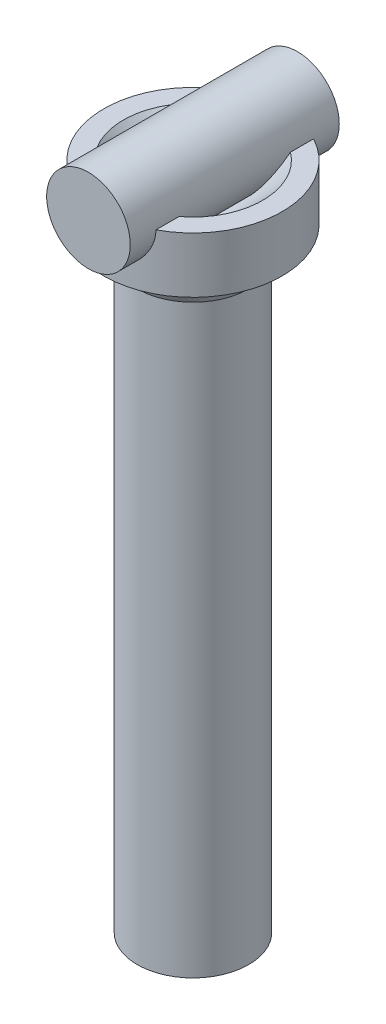
ISO-10303-21;
HEADER;
FILE_DESCRIPTION(('STEP AP214'),'2;1');
FILE_NAME('part.step','',(''),(''),'','','');
FILE_SCHEMA(('AUTOMOTIVE_DESIGN { 1 0 10303 214 1 1 1 1 }'));
ENDSEC;
DATA;
#1=APPLICATION_CONTEXT('core data for automotive mechanical design processes');
#2=APPLICATION_PROTOCOL_DEFINITION('international standard','automotive_design',2000,#1);
#3=PRODUCT_CONTEXT('',#1,'mechanical');
#4=PRODUCT('Part','Part','',(#3));
#5=PRODUCT_RELATED_PRODUCT_CATEGORY('part','',(#4));
#6=PRODUCT_DEFINITION_FORMATION('','',#4);
#7=PRODUCT_DEFINITION_CONTEXT('part definition',#1,'design');
#8=PRODUCT_DEFINITION('design','',#6,#7);
#9=PRODUCT_DEFINITION_SHAPE('','',#8);
#10=(LENGTH_UNIT() NAMED_UNIT(*) SI_UNIT(.MILLI.,.METRE.));
#11=(NAMED_UNIT(*) PLANE_ANGLE_UNIT() SI_UNIT($,.RADIAN.));
#12=(NAMED_UNIT(*) SI_UNIT($,.STERADIAN.) SOLID_ANGLE_UNIT());
#13=UNCERTAINTY_MEASURE_WITH_UNIT(LENGTH_MEASURE(1.E-05),#10,'distance_accuracy_value','');
#14=(GEOMETRIC_REPRESENTATION_CONTEXT(3) GLOBAL_UNCERTAINTY_ASSIGNED_CONTEXT((#13)) GLOBAL_UNIT_ASSIGNED_CONTEXT((#10,
#11,#12)) REPRESENTATION_CONTEXT('',''));
#15=CARTESIAN_POINT('',(0.,0.,0.));
#16=DIRECTION('',(0.,0.,1.));
#17=DIRECTION('',(1.,0.,0.));
#18=AXIS2_PLACEMENT_3D('',#15,#16,#17);
#19=CARTESIAN_POINT('',(0.,24.,0.));
#20=DIRECTION('',(0.,1.,0.));
#21=DIRECTION('',(0.,0.,1.));
#22=AXIS2_PLACEMENT_3D('',#19,#20,#21);
#23=CONICAL_SURFACE('',#22,2.49999999999999,0.785398163397446);
#24=CARTESIAN_POINT('',(0.,22.,0.));
#25=DIRECTION('',(0.,-1.,0.));
#26=DIRECTION('',(0.,0.,-1.));
#27=AXIS2_PLACEMENT_3D('',#24,#25,#26);
#28=CIRCLE('',#27,0.5);
#29=CARTESIAN_POINT('',(0.,22.,-0.5));
#30=VERTEX_POINT('',#29);
#31=EDGE_CURVE('E83',#30,#30,#28,.T.);
#32=ORIENTED_EDGE('',*,*,#31,.T.);
#33=EDGE_LOOP('',(#32));
#34=FACE_BOUND('',#33,.T.);
#35=CARTESIAN_POINT('',(0.,24.,0.));
#36=DIRECTION('',(0.,-1.,0.));
#37=DIRECTION('',(0.,0.,-1.));
#38=AXIS2_PLACEMENT_3D('',#35,#36,#37);
#39=CIRCLE('',#38,2.49999999999999);
#40=CARTESIAN_POINT('',(-1.5,24.,1.99999999999999));
#41=VERTEX_POINT('',#40);
#42=CARTESIAN_POINT('',(-1.5,24.,-1.99999999999999));
#43=VERTEX_POINT('',#42);
#44=EDGE_CURVE('E94',#41,#43,#39,.T.);
#45=ORIENTED_EDGE('',*,*,#44,.F.);
#46=CARTESIAN_POINT('',(-1.49246104136758,24.1502,2.19000458447008));
#47=CARTESIAN_POINT('',(-1.49545373328403,24.1204332284255,2.15194424581476));
#48=CARTESIAN_POINT('',(-1.49756700040411,24.0905299339401,2.11392448433375));
#49=CARTESIAN_POINT('',(-1.49999348097174,24.030429409847,2.03804562222633));
#50=CARTESIAN_POINT('',(-1.50030625716488,24.0002321106229,2.00018656285734));
#51=CARTESIAN_POINT('',(-1.49847011708547,23.9086739873725,1.88635640204489));
#52=CARTESIAN_POINT('',(-1.49349418435268,23.8468523415018,1.81078223914069));
#53=CARTESIAN_POINT('',(-1.4749094087891,23.71887813545,1.65829213932245));
#54=CARTESIAN_POINT('',(-1.46091161586003,23.6526575655866,1.58147602579125));
#55=CARTESIAN_POINT('',(-1.43193911363622,23.5519411644453,1.46981966949783));
#56=CARTESIAN_POINT('',(-1.42097653688784,23.5181940024584,1.43325199984974));
#57=CARTESIAN_POINT('',(-1.39604827781106,23.4501223290974,1.36172665998287));
#58=CARTESIAN_POINT('',(-1.38208450088478,23.4157981967166,1.3267679852641));
#59=CARTESIAN_POINT('',(-1.35671379988755,23.3597842165371,1.27208425136817));
#60=CARTESIAN_POINT('',(-1.34637897901054,23.3382955220747,1.25165709206384));
#61=CARTESIAN_POINT('',(-1.32425868036674,23.2950682808844,1.21188243973796));
#62=CARTESIAN_POINT('',(-1.31247299643341,23.2733296990467,1.19253510072706));
#63=CARTESIAN_POINT('',(-1.27486199850083,23.2080126368588,1.13672986882793));
#64=CARTESIAN_POINT('',(-1.24665384459535,23.164039298895,1.10221549864579));
#65=CARTESIAN_POINT('',(-1.18898169055933,23.0844480574427,1.04728395902017));
#66=CARTESIAN_POINT('',(-1.16084366128249,23.0488790157249,1.02542982177868));
#67=CARTESIAN_POINT('',(-1.09949286441295,22.9785899114538,0.988632459046558));
#68=CARTESIAN_POINT('',(-1.06629014999953,22.9438683217354,0.973675773970397));
#69=CARTESIAN_POINT('',(-0.995311796801577,22.8767286842849,0.951308609800031));
#70=CARTESIAN_POINT('',(-0.9575340140081,22.8443117279519,0.943901684170657));
#71=CARTESIAN_POINT('',(-0.878416605105626,22.7830767578548,0.935581104889029));
#72=CARTESIAN_POINT('',(-0.837066150620353,22.7542703834479,0.934687945918009));
#73=CARTESIAN_POINT('',(-0.728680947529565,22.6865923567045,0.937891950105071));
#74=CARTESIAN_POINT('',(-0.659886964592947,22.6507434865632,0.944960715257169));
#75=CARTESIAN_POINT('',(-0.517814377919438,22.5900864191556,0.961433318398144));
#76=CARTESIAN_POINT('',(-0.444527670679941,22.5652988818479,0.970841475226135));
#77=CARTESIAN_POINT('',(-0.330441882288803,22.5362912717701,0.982944141152358));
#78=CARTESIAN_POINT('',(-0.290792558752224,22.5278980680374,0.986702150792473));
#79=CARTESIAN_POINT('',(-0.210837392361188,22.5143380143809,0.992968429959709));
#80=CARTESIAN_POINT('',(-0.170531534945764,22.5091712361148,0.995476671729714));
#81=CARTESIAN_POINT('',(-0.0896472374492412,22.5021322228247,0.998927653524333));
#82=CARTESIAN_POINT('',(-0.0490695087572387,22.5002533816857,0.999873532429336));
#83=CARTESIAN_POINT('',(0.0321080272166379,22.4997945673366,1.00010249407765));
#84=CARTESIAN_POINT('',(0.072707833096408,22.5012144046421,0.999385672330699));
#85=CARTESIAN_POINT('',(0.151755359037483,22.5071941047252,0.996441053463548));
#86=CARTESIAN_POINT('',(0.19021693166839,22.5116081238985,0.994283505646545));
#87=CARTESIAN_POINT('',(0.266613082470822,22.5233781596632,0.988763521787253));
#88=CARTESIAN_POINT('',(0.304547426989795,22.5307354401478,0.985400568185038));
#89=CARTESIAN_POINT('',(0.379739472723867,22.5483483598889,0.977846968444513));
#90=CARTESIAN_POINT('',(0.416995512690543,22.5586103026348,0.973654528236481));
#91=CARTESIAN_POINT('',(0.490579824669764,22.5819654533556,0.964997471554645));
#92=CARTESIAN_POINT('',(0.52690782956253,22.5950594664542,0.960532777942167));
#93=CARTESIAN_POINT('',(0.622706004793459,22.6338267041692,0.949128484809068));
#94=CARTESIAN_POINT('',(0.681226490131988,22.6620212533671,0.94255511430098));
#95=CARTESIAN_POINT('',(0.794273960047192,22.7259108501976,0.934974670185829));
#96=CARTESIAN_POINT('',(0.848816837910063,22.7615735602941,0.933944093324518));
#97=CARTESIAN_POINT('',(0.939956571088797,22.8299975335892,0.941313798031257));
#98=CARTESIAN_POINT('',(0.977720772666259,22.8614043774955,0.947512176784059));
#99=CARTESIAN_POINT('',(1.04897037493311,22.9266907882809,0.967167336487991));
#100=CARTESIAN_POINT('',(1.08245887689232,22.9605685346058,0.980618819167859));
#101=CARTESIAN_POINT('',(1.14440220316641,23.0291852898999,1.01430416015395));
#102=CARTESIAN_POINT('',(1.17287644305598,23.0639203552671,1.03451093867237));
#103=CARTESIAN_POINT('',(1.22510836085955,23.133395842664,1.08031759598592));
#104=CARTESIAN_POINT('',(1.24885754782806,23.1681361640452,1.1059270162718));
#105=CARTESIAN_POINT('',(1.31004286117673,23.2655989414959,1.18374208422258));
#106=CARTESIAN_POINT('',(1.34258970129083,23.3277422851952,1.24044893459234));
#107=CARTESIAN_POINT('',(1.39726253847492,23.4502880679421,1.36084362672535));
#108=CARTESIAN_POINT('',(1.41931116369436,23.5106745923373,1.42457916220568));
#109=CARTESIAN_POINT('',(1.45231486904234,23.6210787296744,1.54613938689888));
#110=CARTESIAN_POINT('',(1.46442244246609,23.6713185627049,1.60346072260979));
#111=CARTESIAN_POINT('',(1.48326431981676,23.7708797220947,1.7198310722983));
#112=CARTESIAN_POINT('',(1.48999344315336,23.8202001182999,1.77888169534467));
#113=CARTESIAN_POINT('',(1.49845113117792,23.9167398743214,1.89641425578346));
#114=CARTESIAN_POINT('',(1.50030683599659,23.9639803470776,1.95487015180718));
#115=CARTESIAN_POINT('',(1.49961517730403,24.0576531588243,2.07219713550475));
#116=CARTESIAN_POINT('',(1.49707731055579,24.104087022263,2.13106705442375));
#117=CARTESIAN_POINT('',(1.49246104136759,24.1501999999999,2.19000458447017));
#118=B_SPLINE_CURVE_WITH_KNOTS('',3,(#46,#47,#48,#49,#50,#51,#52,#53,#54,#55,#56,#57,#58,#59,
#60,#61,#62,#63,#64,#65,#66,#67,#68,#69,#70,#71,#72,#73,#74,#75,#76,#77,#78,#79,#80,#81,#82,#83,
#84,#85,#86,#87,#88,#89,#90,#91,#92,#93,#94,#95,#96,#97,#98,#99,#100,#101,#102,#103,#104,#105,
#106,#107,#108,#109,#110,#111,#112,#113,#114,#115,#116,#117),.UNSPECIFIED.,.F.,.F.,(4,2,2,2,2,2,
2,2,2,2,2,2,2,2,2,2,2,2,2,2,2,2,2,2,2,2,2,2,2,2,2,2,2,2,2,4),(0.,0.145218511898956,
0.290472289044873,0.583447950018386,0.889985272931979,1.0427587650513,1.19543554933813,
1.28958003770597,1.38373791940917,1.57075839213748,1.72118090446192,1.87130862936062,
2.02150698268081,2.17217771163149,2.40462498038458,2.6375046069712,2.75947822110414,
2.88145454412809,3.00318551002909,3.12490948356831,3.24109378661079,3.35732803508536,
3.47381648658153,3.59033809798078,3.78559583698783,3.98002496285916,4.12783770141319,
4.27554261121989,4.42266238146214,4.57004418512804,4.83911256225435,5.11013440208466,
5.34142216035682,5.57293243031811,5.79834003308423,6.02326102245815),.UNSPECIFIED.);
#119=CARTESIAN_POINT('',(1.5,24.,1.99999999999999));
#120=VERTEX_POINT('',#119);
#121=EDGE_CURVE('E91',#41,#120,#118,.T.);
#122=ORIENTED_EDGE('',*,*,#121,.T.);
#123=CARTESIAN_POINT('',(1.5,24.,-1.99999999999999));
#124=VERTEX_POINT('',#123);
#125=EDGE_CURVE('E90',#124,#120,#39,.T.);
#126=ORIENTED_EDGE('',*,*,#125,.F.);
#127=CARTESIAN_POINT('',(1.49246104136758,24.1502,-2.19000458447008));
#128=CARTESIAN_POINT('',(1.49545373328403,24.1204332284255,-2.15194424581476));
#129=CARTESIAN_POINT('',(1.49756700040411,24.0905299339401,-2.11392448433375));
#130=CARTESIAN_POINT('',(1.49999348097174,24.030429409847,-2.03804562222633));
#131=CARTESIAN_POINT('',(1.50030625716488,24.0002321106229,-2.00018656285734));
#132=CARTESIAN_POINT('',(1.49847011708547,23.9086739873725,-1.88635640204489));
#133=CARTESIAN_POINT('',(1.49349418435268,23.8468523415018,-1.81078223914069));
#134=CARTESIAN_POINT('',(1.4749094087891,23.71887813545,-1.65829213932245));
#135=CARTESIAN_POINT('',(1.46091161586003,23.6526575655866,-1.58147602579125));
#136=CARTESIAN_POINT('',(1.43193911363622,23.5519411644453,-1.46981966949783));
#137=CARTESIAN_POINT('',(1.42097653688784,23.5181940024584,-1.43325199984974));
#138=CARTESIAN_POINT('',(1.39604827781106,23.4501223290974,-1.36172665998287));
#139=CARTESIAN_POINT('',(1.38208450088478,23.4157981967166,-1.3267679852641));
#140=CARTESIAN_POINT('',(1.35671379988755,23.3597842165371,-1.27208425136817));
#141=CARTESIAN_POINT('',(1.34637897901054,23.3382955220747,-1.25165709206384));
#142=CARTESIAN_POINT('',(1.32425868036674,23.2950682808844,-1.21188243973796));
#143=CARTESIAN_POINT('',(1.31247299643341,23.2733296990467,-1.19253510072706));
#144=CARTESIAN_POINT('',(1.27486199850083,23.2080126368588,-1.13672986882793));
#145=CARTESIAN_POINT('',(1.24665384459535,23.164039298895,-1.10221549864579));
#146=CARTESIAN_POINT('',(1.18898169055933,23.0844480574427,-1.04728395902017));
#147=CARTESIAN_POINT('',(1.16084366128249,23.0488790157249,-1.02542982177868));
#148=CARTESIAN_POINT('',(1.09949286441295,22.9785899114538,-0.988632459046558));
#149=CARTESIAN_POINT('',(1.06629014999953,22.9438683217354,-0.973675773970397));
#150=CARTESIAN_POINT('',(0.995311796801577,22.8767286842849,-0.951308609800031));
#151=CARTESIAN_POINT('',(0.9575340140081,22.8443117279519,-0.943901684170657));
#152=CARTESIAN_POINT('',(0.878416605105626,22.7830767578548,-0.935581104889029));
#153=CARTESIAN_POINT('',(0.837066150620353,22.7542703834479,-0.934687945918009));
#154=CARTESIAN_POINT('',(0.728680947529565,22.6865923567045,-0.937891950105071));
#155=CARTESIAN_POINT('',(0.659886964592947,22.6507434865632,-0.944960715257169));
#156=CARTESIAN_POINT('',(0.517814377919438,22.5900864191556,-0.961433318398144));
#157=CARTESIAN_POINT('',(0.444527670679941,22.5652988818479,-0.970841475226135));
#158=CARTESIAN_POINT('',(0.330441882288803,22.5362912717701,-0.982944141152358));
#159=CARTESIAN_POINT('',(0.290792558752224,22.5278980680374,-0.986702150792473));
#160=CARTESIAN_POINT('',(0.210837392361188,22.5143380143809,-0.992968429959709));
#161=CARTESIAN_POINT('',(0.170531534945764,22.5091712361148,-0.995476671729714));
#162=CARTESIAN_POINT('',(0.0896472374492412,22.5021322228247,-0.998927653524333));
#163=CARTESIAN_POINT('',(0.0490695087572387,22.5002533816857,-0.999873532429336));
#164=CARTESIAN_POINT('',(-0.0321080272166379,22.4997945673366,-1.00010249407765));
#165=CARTESIAN_POINT('',(-0.072707833096408,22.5012144046421,-0.999385672330699));
#166=CARTESIAN_POINT('',(-0.151755359037483,22.5071941047252,-0.996441053463548));
#167=CARTESIAN_POINT('',(-0.19021693166839,22.5116081238985,-0.994283505646545));
#168=CARTESIAN_POINT('',(-0.266613082470822,22.5233781596632,-0.988763521787253));
#169=CARTESIAN_POINT('',(-0.304547426989795,22.5307354401478,-0.985400568185038));
#170=CARTESIAN_POINT('',(-0.379739472723867,22.5483483598889,-0.977846968444513));
#171=CARTESIAN_POINT('',(-0.416995512690543,22.5586103026348,-0.973654528236481));
#172=CARTESIAN_POINT('',(-0.490579824669764,22.5819654533556,-0.964997471554645));
#173=CARTESIAN_POINT('',(-0.52690782956253,22.5950594664542,-0.960532777942167));
#174=CARTESIAN_POINT('',(-0.622706004793459,22.6338267041692,-0.949128484809068));
#175=CARTESIAN_POINT('',(-0.681226490131988,22.6620212533671,-0.94255511430098));
#176=CARTESIAN_POINT('',(-0.794273960047192,22.7259108501976,-0.934974670185829));
#177=CARTESIAN_POINT('',(-0.848816837910063,22.7615735602941,-0.933944093324518));
#178=CARTESIAN_POINT('',(-0.939956571088797,22.8299975335892,-0.941313798031257));
#179=CARTESIAN_POINT('',(-0.977720772666259,22.8614043774955,-0.947512176784059));
#180=CARTESIAN_POINT('',(-1.04897037493311,22.9266907882809,-0.967167336487991));
#181=CARTESIAN_POINT('',(-1.08245887689232,22.9605685346058,-0.980618819167859));
#182=CARTESIAN_POINT('',(-1.14440220316641,23.0291852898999,-1.01430416015395));
#183=CARTESIAN_POINT('',(-1.17287644305598,23.0639203552671,-1.03451093867237));
#184=CARTESIAN_POINT('',(-1.22510836085955,23.133395842664,-1.08031759598592));
#185=CARTESIAN_POINT('',(-1.24885754782806,23.1681361640452,-1.1059270162718));
#186=CARTESIAN_POINT('',(-1.31004286117673,23.2655989414959,-1.18374208422258));
#187=CARTESIAN_POINT('',(-1.34258970129083,23.3277422851952,-1.24044893459234));
#188=CARTESIAN_POINT('',(-1.39726253847492,23.4502880679421,-1.36084362672535));
#189=CARTESIAN_POINT('',(-1.41931116369436,23.5106745923373,-1.42457916220568));
#190=CARTESIAN_POINT('',(-1.45231486904234,23.6210787296744,-1.54613938689888));
#191=CARTESIAN_POINT('',(-1.46442244246609,23.6713185627049,-1.60346072260979));
#192=CARTESIAN_POINT('',(-1.48326431981676,23.7708797220947,-1.7198310722983));
#193=CARTESIAN_POINT('',(-1.48999344315336,23.8202001182999,-1.77888169534467));
#194=CARTESIAN_POINT('',(-1.49845113117792,23.9167398743214,-1.89641425578346));
#195=CARTESIAN_POINT('',(-1.50030683599659,23.9639803470776,-1.95487015180718));
#196=CARTESIAN_POINT('',(-1.49961517730403,24.0576531588243,-2.07219713550475));
#197=CARTESIAN_POINT('',(-1.49707731055579,24.104087022263,-2.13106705442375));
#198=CARTESIAN_POINT('',(-1.49246104136759,24.1501999999999,-2.19000458447017));
#199=B_SPLINE_CURVE_WITH_KNOTS('',3,(#127,#128,#129,#130,#131,#132,#133,#134,#135,#136,#137,
#138,#139,#140,#141,#142,#143,#144,#145,#146,#147,#148,#149,#150,#151,#152,#153,#154,#155,#156,
#157,#158,#159,#160,#161,#162,#163,#164,#165,#166,#167,#168,#169,#170,#171,#172,#173,#174,#175,
#176,#177,#178,#179,#180,#181,#182,#183,#184,#185,#186,#187,#188,#189,#190,#191,#192,#193,#194,
#195,#196,#197,#198),.UNSPECIFIED.,.F.,.F.,(4,2,2,2,2,2,2,2,2,2,2,2,2,2,2,2,2,2,2,2,2,2,2,2,2,2,
2,2,2,2,2,2,2,2,2,4),(0.,0.145218511898956,0.290472289044873,0.583447950018386,
0.889985272931979,1.0427587650513,1.19543554933813,1.28958003770597,1.38373791940917,
1.57075839213748,1.72118090446192,1.87130862936062,2.02150698268081,2.17217771163149,
2.40462498038458,2.6375046069712,2.75947822110414,2.88145454412809,3.00318551002909,
3.12490948356831,3.24109378661079,3.35732803508536,3.47381648658153,3.59033809798078,
3.78559583698783,3.98002496285916,4.12783770141319,4.27554261121989,4.42266238146214,
4.57004418512804,4.83911256225435,5.11013440208466,5.34142216035682,5.57293243031811,
5.79834003308423,6.02326102245815),.UNSPECIFIED.);
#200=EDGE_CURVE('E131',#124,#43,#199,.T.);
#201=ORIENTED_EDGE('',*,*,#200,.T.);
#202=EDGE_LOOP('',(#45,#122,#126,#201));
#203=FACE_BOUND('',#202,.T.);
#204=ADVANCED_FACE('F32',(#34,#203),#23,.F.);
#205=CARTESIAN_POINT('',(2.49999999999999,24.,0.));
#206=DIRECTION('',(0.,1.,0.));
#207=DIRECTION('',(0.,0.,1.));
#208=AXIS2_PLACEMENT_3D('',#205,#206,#207);
#209=PLANE('',#208);
#210=CARTESIAN_POINT('',(0.,24.,0.));
#211=DIRECTION('',(0.,-1.,0.));
#212=DIRECTION('',(0.,0.,-1.));
#213=AXIS2_PLACEMENT_3D('',#210,#211,#212);
#214=CIRCLE('',#213,3.2);
#215=CARTESIAN_POINT('',(1.5,24.,-2.82665880502051));
#216=VERTEX_POINT('',#215);
#217=CARTESIAN_POINT('',(1.5,24.,2.82665880502051));
#218=VERTEX_POINT('',#217);
#219=EDGE_CURVE('E88',#216,#218,#214,.T.);
#220=ORIENTED_EDGE('',*,*,#219,.F.);
#221=DIRECTION('',(0.,0.,-1.));
#222=VECTOR('',#221,1.);
#223=CARTESIAN_POINT('',(1.5,24.,3.75));
#224=LINE('',#223,#222);
#225=EDGE_CURVE('E60',#216,#124,#224,.F.);
#226=ORIENTED_EDGE('',*,*,#225,.T.);
#227=ORIENTED_EDGE('',*,*,#125,.T.);
#228=EDGE_CURVE('E77',#120,#218,#224,.F.);
#229=ORIENTED_EDGE('',*,*,#228,.T.);
#230=EDGE_LOOP('',(#220,#226,#227,#229));
#231=FACE_BOUND('',#230,.T.);
#232=ADVANCED_FACE('F87',(#231),#209,.T.);
#233=CARTESIAN_POINT('',(-1.5,24.,2.82665880502051));
#234=VERTEX_POINT('',#233);
#235=CARTESIAN_POINT('',(-1.50000000000053,24.0000000000016,-2.82665880502057));
#236=VERTEX_POINT('',#235);
#237=EDGE_CURVE('E95',#234,#236,#214,.T.);
#238=ORIENTED_EDGE('',*,*,#237,.F.);
#239=DIRECTION('',(0.,0.,-1.));
#240=VECTOR('',#239,1.);
#241=CARTESIAN_POINT('',(-1.5,24.,3.75));
#242=LINE('',#241,#240);
#243=EDGE_CURVE('E52',#234,#41,#242,.T.);
#244=ORIENTED_EDGE('',*,*,#243,.T.);
#245=ORIENTED_EDGE('',*,*,#44,.T.);
#246=EDGE_CURVE('E129',#43,#236,#242,.T.);
#247=ORIENTED_EDGE('',*,*,#246,.T.);
#248=EDGE_LOOP('',(#238,#244,#245,#247));
#249=FACE_BOUND('',#248,.T.);
#250=ADVANCED_FACE('F158',(#249),#209,.T.);
#251=CARTESIAN_POINT('',(0.,0.,0.));
#252=DIRECTION('',(0.,-1.,0.));
#253=DIRECTION('',(0.,0.,-1.));
#254=AXIS2_PLACEMENT_3D('',#251,#252,#253);
#255=CYLINDRICAL_SURFACE('',#254,3.2);
#256=CARTESIAN_POINT('',(0.,22.,0.));
#257=DIRECTION('',(0.,-1.,0.));
#258=DIRECTION('',(0.,0.,-1.));
#259=AXIS2_PLACEMENT_3D('',#256,#257,#258);
#260=CIRCLE('',#259,3.2);
#261=CARTESIAN_POINT('',(0.,22.,-3.2));
#262=VERTEX_POINT('',#261);
#263=EDGE_CURVE('E99',#262,#262,#260,.T.);
#264=ORIENTED_EDGE('',*,*,#263,.F.);
#265=EDGE_LOOP('',(#264));
#266=FACE_BOUND('',#265,.T.);
#267=ORIENTED_EDGE('',*,*,#237,.T.);
#268=CARTESIAN_POINT('',(0.,25.5,-3.2));
#269=CARTESIAN_POINT('',(-0.0794366297653684,25.4999956105829,-3.19999630571425));
#270=CARTESIAN_POINT('',(-0.158985054285573,25.4936526432925,-3.19700957899868));
#271=CARTESIAN_POINT('',(-0.315767144342182,25.4685442516593,-3.18535757334793));
#272=CARTESIAN_POINT('',(-0.392995334806227,25.449751539829,-3.17667982118131));
#273=CARTESIAN_POINT('',(-0.542623613933926,25.4006198880662,-3.15456154654934));
#274=CARTESIAN_POINT('',(-0.615040476822123,25.3703238372491,-3.14113872828529));
#275=CARTESIAN_POINT('',(-0.753673316550172,25.2992496399022,-3.11079077785621));
#276=CARTESIAN_POINT('',(-0.8198902957291,25.2584731917509,-3.09386621324576));
#277=CARTESIAN_POINT('',(-0.948350357177739,25.1650249277608,-3.0570148530726));
#278=CARTESIAN_POINT('',(-1.01017369872327,25.1118216432957,-3.03697404361316));
#279=CARTESIAN_POINT('',(-1.12439785354931,24.9961641953044,-2.99656590387073));
#280=CARTESIAN_POINT('',(-1.17679240559473,24.933703934463,-2.97619836632648));
#281=CARTESIAN_POINT('',(-1.27411857201608,24.7963434071221,-2.93591183357015));
#282=CARTESIAN_POINT('',(-1.31833010930722,24.7208943837464,-2.91611100881908));
#283=CARTESIAN_POINT('',(-1.39325151163875,24.562587259413,-2.8810715047924));
#284=CARTESIAN_POINT('',(-1.4239700636606,24.47973396691,-2.86582989225174));
#285=CARTESIAN_POINT('',(-1.46919263785962,24.3137612794281,-2.84290120635756));
#286=CARTESIAN_POINT('',(-1.48450988794257,24.2309177721529,-2.83483816808474));
#287=CARTESIAN_POINT('',(-1.50101060360856,24.0634755266261,-2.82613943112327));
#288=CARTESIAN_POINT('',(-1.50220525058387,23.9788782300868,-2.82549785659326));
#289=CARTESIAN_POINT('',(-1.49102860152934,23.8195723747177,-2.83140540410836));
#290=CARTESIAN_POINT('',(-1.48002746065053,23.7447346838905,-2.83722835518323));
#291=CARTESIAN_POINT('',(-1.44711565103969,23.5981251446924,-2.85415400915747));
#292=CARTESIAN_POINT('',(-1.42520214213451,23.5263540997636,-2.86525808654715));
#293=CARTESIAN_POINT('',(-1.37065958454469,23.3859141522109,-2.89175132581127));
#294=CARTESIAN_POINT('',(-1.33779469146436,23.3173552125722,-2.90723355127044));
#295=CARTESIAN_POINT('',(-1.26245573982023,23.186416964084,-2.94073170962084));
#296=CARTESIAN_POINT('',(-1.21997747050553,23.124040380433,-2.95874875147367));
#297=CARTESIAN_POINT('',(-1.12117144504836,23.0000360348979,-2.99768064068318));
#298=CARTESIAN_POINT('',(-1.06383576537821,22.9392404977255,-3.01869659998739));
#299=CARTESIAN_POINT('',(-0.939641687550934,22.8278067269063,-3.05963196112561));
#300=CARTESIAN_POINT('',(-0.872779758723928,22.7771722760493,-3.07955095258331));
#301=CARTESIAN_POINT('',(-0.728323977918188,22.6858067067883,-3.11693783151282));
#302=CARTESIAN_POINT('',(-0.650429064841608,22.6455008665032,-3.13429076469825));
#303=CARTESIAN_POINT('',(-0.487942227794179,22.5788711291003,-3.16365420400246));
#304=CARTESIAN_POINT('',(-0.403355047372972,22.5525374286218,-3.1756684549702));
#305=CARTESIAN_POINT('',(-0.236758036703878,22.5165412333474,-3.19224313378799));
#306=CARTESIAN_POINT('',(-0.155037856315182,22.5057675969872,-3.19729898462949));
#307=CARTESIAN_POINT('',(0.00919528809397387,22.4977795082271,-3.20103907716323));
#308=CARTESIAN_POINT('',(0.0917079278381507,22.5005597272975,-3.199725822791));
#309=CARTESIAN_POINT('',(0.249398024817891,22.5188907886389,-3.19117976213987));
#310=CARTESIAN_POINT('',(0.324699508933728,22.5335841944089,-3.18434450990737));
#311=CARTESIAN_POINT('',(0.471643871417134,22.5740401001974,-3.16591825802244));
#312=CARTESIAN_POINT('',(0.543286322002912,22.5998038911679,-3.15432670372993));
#313=CARTESIAN_POINT('',(0.683383574707804,22.6624440265986,-3.12701756569302));
#314=CARTESIAN_POINT('',(0.751674047016102,22.6996359188851,-3.11118471264979));
#315=CARTESIAN_POINT('',(0.88128616247221,22.783731219636,-3.07698472270415));
#316=CARTESIAN_POINT('',(0.942604726049461,22.8306388940561,-3.05861647375887));
#317=CARTESIAN_POINT('',(1.06226746295268,22.9376501866046,-3.01925452981606));
#318=CARTESIAN_POINT('',(1.11986840035393,22.9985541611109,-2.99817233580377));
#319=CARTESIAN_POINT('',(1.22431969123982,23.1293394865031,-2.95705916335382));
#320=CARTESIAN_POINT('',(1.27116477824616,23.1992252091888,-2.93702870357223));
#321=CARTESIAN_POINT('',(1.35418065576862,23.3490279572482,-2.89971388021076));
#322=CARTESIAN_POINT('',(1.38994353105744,23.4292017300856,-2.88254332558056));
#323=CARTESIAN_POINT('',(1.4470971383464,23.5955032981221,-2.85428508393637));
#324=CARTESIAN_POINT('',(1.46850394342155,23.6816243151755,-2.84319059671076));
#325=CARTESIAN_POINT('',(1.49455896187423,23.8489905954208,-2.82957416856734));
#326=CARTESIAN_POINT('',(1.50054972888926,23.929970739588,-2.82636665307332));
#327=CARTESIAN_POINT('',(1.49937130319664,24.0917963082829,-2.82699286139304));
#328=CARTESIAN_POINT('',(1.49220590575928,24.1726417649312,-2.83082455454675));
#329=CARTESIAN_POINT('',(1.46613131656595,24.3256303053175,-2.84440619852351));
#330=CARTESIAN_POINT('',(1.44813274734755,24.3979740549795,-2.85369602866639));
#331=CARTESIAN_POINT('',(1.40193210541393,24.538578312548,-2.87667309849877));
#332=CARTESIAN_POINT('',(1.37372698279688,24.6068375928292,-2.89036165246904));
#333=CARTESIAN_POINT('',(1.30578840174151,24.7423181678849,-2.92171219398703));
#334=CARTESIAN_POINT('',(1.26541393094301,24.8091697357933,-2.93957763369423));
#335=CARTESIAN_POINT('',(1.17505974072646,24.9355618374978,-2.97684766005847));
#336=CARTESIAN_POINT('',(1.12507549698615,24.99509890587,-2.99625296915541));
#337=CARTESIAN_POINT('',(1.01093776241371,25.1114406539838,-3.03677948258486));
#338=CARTESIAN_POINT('',(0.945860595498029,25.167352978272,-3.05787468390215));
#339=CARTESIAN_POINT('',(0.806562992145148,25.2676031950751,-3.09753038570267));
#340=CARTESIAN_POINT('',(0.732338206421694,25.3119355503386,-3.11608967155914));
#341=CARTESIAN_POINT('',(0.576903485633842,25.3873025546057,-3.14856405697806));
#342=CARTESIAN_POINT('',(0.49572795580457,25.4183986152204,-3.16250053665866));
#343=CARTESIAN_POINT('',(0.328585281775291,25.466130445569,-3.18419214255065));
#344=CARTESIAN_POINT('',(0.242633177608916,25.4828091394575,-3.19196561184219));
#345=CARTESIAN_POINT('',(0.129990114749172,25.4945850673244,-3.19746509257475));
#346=CARTESIAN_POINT('',(0.104046547063509,25.4966134225616,-3.19841374704826));
#347=CARTESIAN_POINT('',(0.0520726592552672,25.4993216223633,-3.19968181283614));
#348=CARTESIAN_POINT('',(0.0260423373483138,25.5000014390173,-3.20000121112686));
#349=CARTESIAN_POINT('',(0.,25.5,-3.2));
#350=B_SPLINE_CURVE_WITH_KNOTS('',3,(#268,#269,#270,#271,#272,#273,#274,#275,#276,#277,#278,
#279,#280,#281,#282,#283,#284,#285,#286,#287,#288,#289,#290,#291,#292,#293,#294,#295,#296,#297,
#298,#299,#300,#301,#302,#303,#304,#305,#306,#307,#308,#309,#310,#311,#312,#313,#314,#315,#316,
#317,#318,#319,#320,#321,#322,#323,#324,#325,#326,#327,#328,#329,#330,#331,#332,#333,#334,#335,
#336,#337,#338,#339,#340,#341,#342,#343,#344,#345,#346,#347,#348,#349),.UNSPECIFIED.,.T.,.F.,(4,
2,2,2,2,2,2,2,2,2,2,2,2,2,2,2,2,2,2,2,2,2,2,2,2,2,2,2,2,2,2,2,2,2,2,2,2,2,2,2,4),(0.,
0.238203501088987,0.476930834285989,0.714776698722004,0.952584043830981,1.20348916300414,
1.45456028706045,1.72218974999843,1.98964665571215,2.24209356207649,2.49434058339923,
2.72088002998001,2.94747846905439,3.17931153510989,3.41124634347932,3.66861529673091,
3.92607988679166,4.19287274050011,4.45947815428198,4.70590077523508,4.95222652601424,
5.18224856612757,5.41229743710969,5.64937682702354,5.88656053405106,6.14473054024122,
6.40302668810359,6.66993374182533,6.93654146493569,7.1789957704764,7.42138014415691,
7.64578370611675,7.87025437934698,8.10962662086821,8.34911183707249,8.61293149323581,
8.87687707137174,9.13958432454605,9.40150671085487,9.4795972286001,9.55768936255935),.UNSPECIFIED.);
#351=EDGE_CURVE('E11',#236,#216,#350,.T.);
#352=ORIENTED_EDGE('',*,*,#351,.T.);
#353=ORIENTED_EDGE('',*,*,#219,.T.);
#354=CARTESIAN_POINT('',(-1.5,24.,2.82665880502051));
#355=CARTESIAN_POINT('',(-1.49999534442179,24.0788945253923,2.8266642148502));
#356=CARTESIAN_POINT('',(-1.49373514764765,24.1579051491551,2.83001078526979));
#357=CARTESIAN_POINT('',(-1.46898675331296,24.3135596443632,2.84293191540868));
#358=CARTESIAN_POINT('',(-1.45046975054932,24.3901974942605,2.85252114537087));
#359=CARTESIAN_POINT('',(-1.40214204913472,24.5385683858882,2.87658052999138));
#360=CARTESIAN_POINT('',(-1.37238575402327,24.6103231203088,2.89102713620963));
#361=CARTESIAN_POINT('',(-1.30258883001776,24.7478046256391,2.92313754926766));
#362=CARTESIAN_POINT('',(-1.262548773274,24.8135317316278,2.94080117710839));
#363=CARTESIAN_POINT('',(-1.16993217317623,24.9423346348126,2.97891569935292));
#364=CARTESIAN_POINT('',(-1.11666038099966,25.0048784693518,2.99947571550853));
#365=CARTESIAN_POINT('',(-1.00054397871763,25.1205498879335,3.04018037561008));
#366=CARTESIAN_POINT('',(-0.937695082888671,25.1736732331932,3.06032482898787));
#367=CARTESIAN_POINT('',(-0.799783962976717,25.2719735796933,3.09931652970437));
#368=CARTESIAN_POINT('',(-0.72422728837474,25.3165180882463,3.11802260082004));
#369=CARTESIAN_POINT('',(-0.565653325821284,25.3920254344051,3.15064615897713));
#370=CARTESIAN_POINT('',(-0.48264022040496,25.4229958295168,3.16456630968837));
#371=CARTESIAN_POINT('',(-0.317126806316638,25.4684406191745,3.18526856053539));
#372=CARTESIAN_POINT('',(-0.234931908001022,25.4838416777607,3.19244952784134));
#373=CARTESIAN_POINT('',(-0.0688336019528179,25.5007397877499,3.20033754266356));
#374=CARTESIAN_POINT('',(0.0150688889533723,25.5022441128753,3.2010479769342));
#375=CARTESIAN_POINT('',(0.175325908645041,25.4917147298427,3.19612237590297));
#376=CARTESIAN_POINT('',(0.25176600077225,25.4807099792309,3.19096867300393));
#377=CARTESIAN_POINT('',(0.401566261489637,25.4472854024862,3.17559688118972));
#378=CARTESIAN_POINT('',(0.474926200839514,25.4248647283478,3.16537841605189));
#379=CARTESIAN_POINT('',(0.617827561974966,25.3690376676135,3.14064176478271));
#380=CARTESIAN_POINT('',(0.687295991318203,25.3354728983236,3.12606190795924));
#381=CARTESIAN_POINT('',(0.819793243763455,25.2584974256371,3.09396076425213));
#382=CARTESIAN_POINT('',(0.882819694051571,25.2150831131193,3.07643839977242));
#383=CARTESIAN_POINT('',(1.00639503519307,25.1153482177645,3.03837115452596));
#384=CARTESIAN_POINT('',(1.06626938105455,25.0582407031403,3.01769593797095));
#385=CARTESIAN_POINT('',(1.17592899904208,24.9348840872996,2.97668029635137));
#386=CARTESIAN_POINT('',(1.22570812051623,24.8686294541428,2.9563400822832));
#387=CARTESIAN_POINT('',(1.31619349697407,24.7247171025812,2.91722293197092));
#388=CARTESIAN_POINT('',(1.35631436248072,24.6466524072331,2.89857688072809));
#389=CARTESIAN_POINT('',(1.42255502896044,24.4837833207076,2.86665380727763));
#390=CARTESIAN_POINT('',(1.44868780714916,24.3989852604797,2.85337181147559));
#391=CARTESIAN_POINT('',(1.48425408777361,24.2318050905677,2.8350245793705));
#392=CARTESIAN_POINT('',(1.49479416780198,24.1497196846291,2.82941724753518));
#393=CARTESIAN_POINT('',(1.50218932472109,23.9847792183246,2.82550007628063));
#394=CARTESIAN_POINT('',(1.49905170593736,23.9019245923325,2.82718634184502));
#395=CARTESIAN_POINT('',(1.48019520377613,23.745738781031,2.83709573371358));
#396=CARTESIAN_POINT('',(1.465638172204,23.6722233072608,2.84471473829363));
#397=CARTESIAN_POINT('',(1.42600692148318,23.5287844188163,2.86478512204217));
#398=CARTESIAN_POINT('',(1.40092974704494,23.458862019699,2.87723785901596));
#399=CARTESIAN_POINT('',(1.33972360771929,23.3209613572722,2.90625770829253));
#400=CARTESIAN_POINT('',(1.30313883383505,23.2532209496381,2.92298789818481));
#401=CARTESIAN_POINT('',(1.22037249905087,23.1244687969309,2.95849920554547));
#402=CARTESIAN_POINT('',(1.17418618044237,23.0634604107042,2.97728133758425));
#403=CARTESIAN_POINT('',(1.06768153653617,22.9430260143997,3.01722130007392));
#404=CARTESIAN_POINT('',(1.00637589029433,22.8844817271232,3.03841671948087));
#405=CARTESIAN_POINT('',(0.874401114318676,22.7782810451095,3.07899105336241));
#406=CARTESIAN_POINT('',(0.803729958294489,22.7306270126473,3.09836957318506));
#407=CARTESIAN_POINT('',(0.653420325565412,22.6470239306345,3.13354138290467));
#408=CARTESIAN_POINT('',(0.573661120729938,22.6112652610529,3.14927523853579));
#409=CARTESIAN_POINT('',(0.408314262805771,22.5539994130506,3.17494205534582));
#410=CARTESIAN_POINT('',(0.322731150766815,22.5324812682157,3.18487947956831));
#411=CARTESIAN_POINT('',(0.155931915725283,22.5059421533672,3.19719966390802));
#412=CARTESIAN_POINT('',(0.0749531199358786,22.4996868926857,3.20014706181601));
#413=CARTESIAN_POINT('',(-0.0869290778229891,22.500337010892,3.19984173349638));
#414=CARTESIAN_POINT('',(-0.167832494268725,22.5072388271653,3.19659068565619));
#415=CARTESIAN_POINT('',(-0.322769326022857,22.5331450641832,3.18457900306806));
#416=CARTESIAN_POINT('',(-0.39693928755067,22.5514863753143,3.17612055061884));
#417=CARTESIAN_POINT('',(-0.541065681591976,22.5989265179455,3.15476775036314));
#418=CARTESIAN_POINT('',(-0.611021432272114,22.6280270848197,3.14187268699334));
#419=CARTESIAN_POINT('',(-0.748258623829553,22.6975814874178,3.11211545272628));
#420=CARTESIAN_POINT('',(-0.815275715673696,22.7384895679587,3.09510014327356));
#421=CARTESIAN_POINT('',(-0.941787041319146,22.8298997573563,3.05898228022753));
#422=CARTESIAN_POINT('',(-1.00127785898228,22.8804061970207,3.03987878609847));
#423=CARTESIAN_POINT('',(-1.11654643023723,22.9947721341526,2.99956214654449));
#424=CARTESIAN_POINT('',(-1.17153528156035,23.0594160362705,2.9783114179685));
#425=CARTESIAN_POINT('',(-1.27010801465348,23.1974895849313,2.9376312816813));
#426=CARTESIAN_POINT('',(-1.31368371146436,23.2709254819706,2.91820318744834));
#427=CARTESIAN_POINT('',(-1.38857893997646,23.4260863745158,2.88332912075428));
#428=CARTESIAN_POINT('',(-1.41971234368838,23.5079157808991,2.86794472227833));
#429=CARTESIAN_POINT('',(-1.46730445163067,23.6765265467857,2.84389682620756));
#430=CARTESIAN_POINT('',(-1.48381242348436,23.7632902251501,2.83521077728611));
#431=CARTESIAN_POINT('',(-1.49504495457181,23.8756420181262,2.82928301274936));
#432=CARTESIAN_POINT('',(-1.49690088492124,23.9004630904929,2.82830152408248));
#433=CARTESIAN_POINT('',(-1.49937917216616,23.9501855804885,2.82698855054183));
#434=CARTESIAN_POINT('',(-1.50000147011989,23.9750870018996,2.82665709672611));
#435=CARTESIAN_POINT('',(-1.5,24.,2.82665880502051));
#436=B_SPLINE_CURVE_WITH_KNOTS('',3,(#354,#355,#356,#357,#358,#359,#360,#361,#362,#363,#364,
#365,#366,#367,#368,#369,#370,#371,#372,#373,#374,#375,#376,#377,#378,#379,#380,#381,#382,#383,
#384,#385,#386,#387,#388,#389,#390,#391,#392,#393,#394,#395,#396,#397,#398,#399,#400,#401,#402,
#403,#404,#405,#406,#407,#408,#409,#410,#411,#412,#413,#414,#415,#416,#417,#418,#419,#420,#421,
#422,#423,#424,#425,#426,#427,#428,#429,#430,#431,#432,#433,#434,#435),.UNSPECIFIED.,.T.,.F.,(4,
2,2,2,2,2,2,2,2,2,2,2,2,2,2,2,2,2,2,2,2,2,2,2,2,2,2,2,2,2,2,2,2,2,2,2,2,2,2,2,4),(0.,
0.236578865569969,0.473715707935468,0.709719106704938,0.945709377965201,1.19869755272018,
1.45179927315993,1.71945324128941,1.98695800085537,2.23738993553925,2.48769078361561,
2.71880408657277,2.94993455975282,3.18450155646415,3.41915464366414,3.67390550034586,
3.92881110419949,4.19659415024691,4.46412833253618,4.71157381584695,4.95888717160431,
5.1838647608341,5.40890559251433,5.644310912803,5.87983315916813,6.14077942888756,
6.40178224852391,6.66678115538478,6.93157575236338,7.17412020271273,7.4165989872871,
7.6461832413093,7.87580454143396,8.11581869746952,8.35594140682607,8.61721954934231,
8.87868455792893,9.14392633696896,9.40827118033528,9.48297354041803,9.55767946962198),.UNSPECIFIED.);
#437=EDGE_CURVE('E45',#218,#234,#436,.T.);
#438=ORIENTED_EDGE('',*,*,#437,.T.);
#439=EDGE_LOOP('',(#267,#352,#353,#438));
#440=FACE_BOUND('',#439,.T.);
#441=ADVANCED_FACE('F93',(#266,#440),#255,.T.);
#442=CARTESIAN_POINT('',(2.,0.,0.));
#443=DIRECTION('',(0.,-1.,0.));
#444=DIRECTION('',(0.,0.,-1.));
#445=AXIS2_PLACEMENT_3D('',#442,#443,#444);
#446=PLANE('',#445);
#447=CARTESIAN_POINT('',(0.,0.,0.));
#448=DIRECTION('',(0.,-1.,0.));
#449=DIRECTION('',(0.,0.,-1.));
#450=AXIS2_PLACEMENT_3D('',#447,#448,#449);
#451=CIRCLE('',#450,2.);
#452=CARTESIAN_POINT('',(0.,0.,-2.));
#453=VERTEX_POINT('',#452);
#454=EDGE_CURVE('E164',#453,#453,#451,.T.);
#455=ORIENTED_EDGE('',*,*,#454,.T.);
#456=EDGE_LOOP('',(#455));
#457=FACE_BOUND('',#456,.T.);
#458=ADVANCED_FACE('F34',(#457),#446,.T.);
#459=CARTESIAN_POINT('',(0.,22.,0.));
#460=DIRECTION('',(0.,1.,0.));
#461=DIRECTION('',(0.,0.,1.));
#462=AXIS2_PLACEMENT_3D('',#459,#460,#461);
#463=PLANE('',#462);
#464=ORIENTED_EDGE('',*,*,#31,.F.);
#465=EDGE_LOOP('',(#464));
#466=FACE_BOUND('',#465,.T.);
#467=ADVANCED_FACE('F140',(#466),#463,.T.);
#468=CARTESIAN_POINT('',(3.2,22.,0.));
#469=DIRECTION('',(0.,-1.,0.));
#470=DIRECTION('',(0.,0.,-1.));
#471=AXIS2_PLACEMENT_3D('',#468,#469,#470);
#472=PLANE('',#471);
#473=ORIENTED_EDGE('',*,*,#263,.T.);
#474=EDGE_LOOP('',(#473));
#475=FACE_BOUND('',#474,.T.);
#476=CARTESIAN_POINT('',(0.,22.,0.));
#477=DIRECTION('',(0.,-1.,0.));
#478=DIRECTION('',(0.,0.,-1.));
#479=AXIS2_PLACEMENT_3D('',#476,#477,#478);
#480=CIRCLE('',#479,2.40945178967204);
#481=CARTESIAN_POINT('',(0.,22.,-2.40945178967204));
#482=VERTEX_POINT('',#481);
#483=EDGE_CURVE('E169',#482,#482,#480,.T.);
#484=ORIENTED_EDGE('',*,*,#483,.F.);
#485=EDGE_LOOP('',(#484));
#486=FACE_BOUND('',#485,.T.);
#487=ADVANCED_FACE('F143',(#475,#486),#472,.T.);
#488=CARTESIAN_POINT('',(0.,21.,0.));
#489=DIRECTION('',(0.,1.,0.));
#490=DIRECTION('',(0.,0.,1.));
#491=AXIS2_PLACEMENT_3D('',#488,#489,#490);
#492=CONICAL_SURFACE('',#491,2.,0.388627822789869);
#493=ORIENTED_EDGE('',*,*,#483,.T.);
#494=EDGE_LOOP('',(#493));
#495=FACE_BOUND('',#494,.T.);
#496=CARTESIAN_POINT('',(0.,21.,0.));
#497=DIRECTION('',(0.,-1.,0.));
#498=DIRECTION('',(0.,0.,-1.));
#499=AXIS2_PLACEMENT_3D('',#496,#497,#498);
#500=CIRCLE('',#499,2.);
#501=CARTESIAN_POINT('',(0.,21.,-2.));
#502=VERTEX_POINT('',#501);
#503=EDGE_CURVE('E166',#502,#502,#500,.T.);
#504=ORIENTED_EDGE('',*,*,#503,.F.);
#505=EDGE_LOOP('',(#504));
#506=FACE_BOUND('',#505,.T.);
#507=ADVANCED_FACE('F149',(#495,#506),#492,.T.);
#508=CARTESIAN_POINT('',(0.,0.,0.));
#509=DIRECTION('',(0.,-1.,0.));
#510=DIRECTION('',(0.,0.,-1.));
#511=AXIS2_PLACEMENT_3D('',#508,#509,#510);
#512=CYLINDRICAL_SURFACE('',#511,2.);
#513=ORIENTED_EDGE('',*,*,#503,.T.);
#514=EDGE_LOOP('',(#513));
#515=FACE_BOUND('',#514,.T.);
#516=ORIENTED_EDGE('',*,*,#454,.F.);
#517=EDGE_LOOP('',(#516));
#518=FACE_BOUND('',#517,.T.);
#519=ADVANCED_FACE('F115',(#515,#518),#512,.T.);
#520=CARTESIAN_POINT('',(0.,24.,3.75));
#521=DIRECTION('',(0.,0.,-1.));
#522=DIRECTION('',(-1.,0.,0.));
#523=AXIS2_PLACEMENT_3D('',#520,#521,#522);
#524=CYLINDRICAL_SURFACE('',#523,1.5);
#525=ORIENTED_EDGE('',*,*,#200,.F.);
#526=ORIENTED_EDGE('',*,*,#225,.F.);
#527=ORIENTED_EDGE('',*,*,#351,.F.);
#528=ORIENTED_EDGE('',*,*,#246,.F.);
#529=EDGE_LOOP('',(#525,#526,#527,#528));
#530=FACE_BOUND('',#529,.T.);
#531=ORIENTED_EDGE('',*,*,#121,.F.);
#532=ORIENTED_EDGE('',*,*,#243,.F.);
#533=ORIENTED_EDGE('',*,*,#437,.F.);
#534=ORIENTED_EDGE('',*,*,#228,.F.);
#535=EDGE_LOOP('',(#531,#532,#533,#534));
#536=FACE_BOUND('',#535,.T.);
#537=CARTESIAN_POINT('',(0.,24.,3.75));
#538=DIRECTION('',(0.,0.,1.));
#539=DIRECTION('',(1.,0.,0.));
#540=AXIS2_PLACEMENT_3D('',#537,#538,#539);
#541=CIRCLE('',#540,1.5);
#542=CARTESIAN_POINT('',(1.5,24.,3.75));
#543=VERTEX_POINT('',#542);
#544=EDGE_CURVE('E159',#543,#543,#541,.T.);
#545=ORIENTED_EDGE('',*,*,#544,.F.);
#546=EDGE_LOOP('',(#545));
#547=FACE_BOUND('',#546,.T.);
#548=CARTESIAN_POINT('',(0.,24.,-3.75));
#549=DIRECTION('',(0.,0.,1.));
#550=DIRECTION('',(1.,0.,0.));
#551=AXIS2_PLACEMENT_3D('',#548,#549,#550);
#552=CIRCLE('',#551,1.5);
#553=CARTESIAN_POINT('',(1.5,24.,-3.75));
#554=VERTEX_POINT('',#553);
#555=EDGE_CURVE('E161',#554,#554,#552,.T.);
#556=ORIENTED_EDGE('',*,*,#555,.T.);
#557=EDGE_LOOP('',(#556));
#558=FACE_BOUND('',#557,.T.);
#559=ADVANCED_FACE('F75',(#530,#536,#547,#558),#524,.T.);
#560=CARTESIAN_POINT('',(0.,24.,3.75));
#561=DIRECTION('',(0.,0.,1.));
#562=DIRECTION('',(1.,0.,0.));
#563=AXIS2_PLACEMENT_3D('',#560,#561,#562);
#564=PLANE('',#563);
#565=ORIENTED_EDGE('',*,*,#544,.T.);
#566=EDGE_LOOP('',(#565));
#567=FACE_BOUND('',#566,.T.);
#568=ADVANCED_FACE('F114',(#567),#564,.T.);
#569=CARTESIAN_POINT('',(0.,24.,-3.75));
#570=DIRECTION('',(0.,0.,1.));
#571=DIRECTION('',(1.,0.,0.));
#572=AXIS2_PLACEMENT_3D('',#569,#570,#571);
#573=PLANE('',#572);
#574=ORIENTED_EDGE('',*,*,#555,.F.);
#575=EDGE_LOOP('',(#574));
#576=FACE_BOUND('',#575,.T.);
#577=ADVANCED_FACE('F116',(#576),#573,.F.);
#578=CLOSED_SHELL('',(#204,#232,#250,#441,#458,#467,#487,#507,#519,#559,#568,#577));
#579=MANIFOLD_SOLID_BREP('B2',#578);
#580=ADVANCED_BREP_SHAPE_REPRESENTATION('',(#18,#579),#14);
#581=SHAPE_DEFINITION_REPRESENTATION(#9,#580);
ENDSEC;
END-ISO-10303-21;
